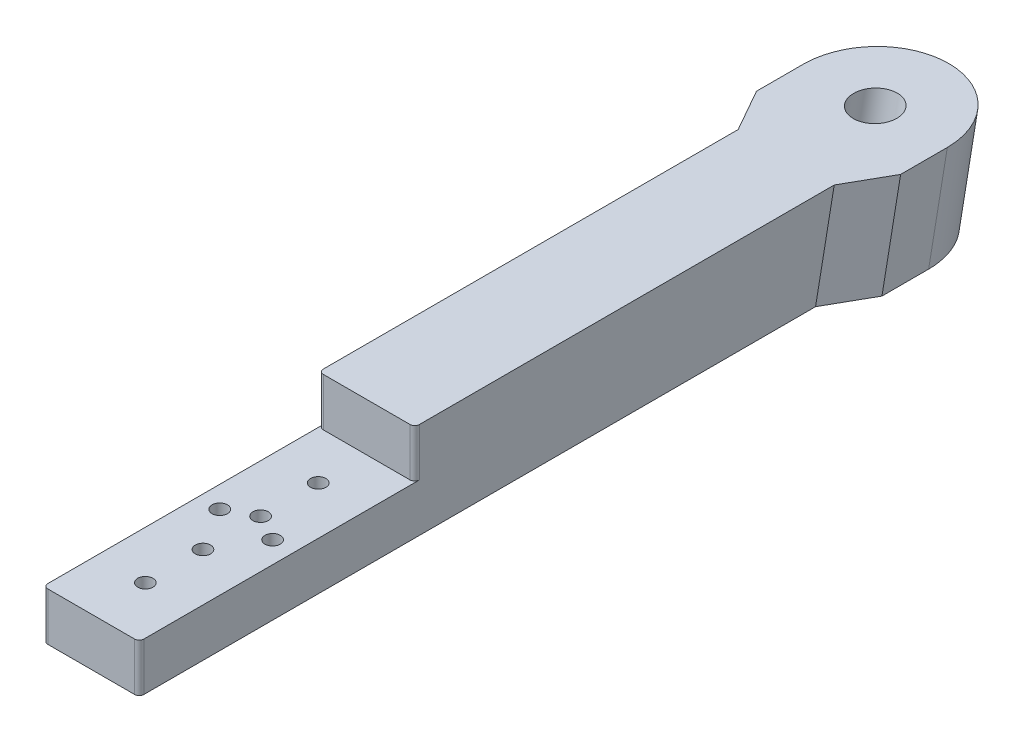
ISO-10303-21;
HEADER;
FILE_DESCRIPTION(('STEP AP214'),'2;1');
FILE_NAME('part.step','',(''),(''),'','','');
FILE_SCHEMA(('AUTOMOTIVE_DESIGN { 1 0 10303 214 1 1 1 1 }'));
ENDSEC;
DATA;
#1=APPLICATION_CONTEXT('core data for automotive mechanical design processes');
#2=APPLICATION_PROTOCOL_DEFINITION('international standard','automotive_design',2000,#1);
#3=PRODUCT_CONTEXT('',#1,'mechanical');
#4=PRODUCT('Part','Part','',(#3));
#5=PRODUCT_RELATED_PRODUCT_CATEGORY('part','',(#4));
#6=PRODUCT_DEFINITION_FORMATION('','',#4);
#7=PRODUCT_DEFINITION_CONTEXT('part definition',#1,'design');
#8=PRODUCT_DEFINITION('design','',#6,#7);
#9=PRODUCT_DEFINITION_SHAPE('','',#8);
#10=(LENGTH_UNIT() NAMED_UNIT(*) SI_UNIT(.MILLI.,.METRE.));
#11=(NAMED_UNIT(*) PLANE_ANGLE_UNIT() SI_UNIT($,.RADIAN.));
#12=(NAMED_UNIT(*) SI_UNIT($,.STERADIAN.) SOLID_ANGLE_UNIT());
#13=UNCERTAINTY_MEASURE_WITH_UNIT(LENGTH_MEASURE(1.E-05),#10,'distance_accuracy_value','');
#14=(GEOMETRIC_REPRESENTATION_CONTEXT(3) GLOBAL_UNCERTAINTY_ASSIGNED_CONTEXT((#13)) GLOBAL_UNIT_ASSIGNED_CONTEXT((#10,
#11,#12)) REPRESENTATION_CONTEXT('',''));
#15=CARTESIAN_POINT('',(0.,0.,0.));
#16=DIRECTION('',(0.,0.,1.));
#17=DIRECTION('',(1.,0.,0.));
#18=AXIS2_PLACEMENT_3D('',#15,#16,#17);
#19=CARTESIAN_POINT('',(-9.,10.,-58.35));
#20=DIRECTION('',(0.,1.,0.));
#21=DIRECTION('',(0.,0.,1.));
#22=AXIS2_PLACEMENT_3D('',#19,#20,#21);
#23=CYLINDRICAL_SURFACE('',#22,1.);
#24=CARTESIAN_POINT('',(-9.,10.,-58.35));
#25=DIRECTION('',(0.,1.,0.));
#26=DIRECTION('',(0.,0.,1.));
#27=AXIS2_PLACEMENT_3D('',#24,#25,#26);
#28=CIRCLE('',#27,1.);
#29=CARTESIAN_POINT('',(-10.,10.,-58.35));
#30=VERTEX_POINT('',#29);
#31=CARTESIAN_POINT('',(-9.,10.,-57.35));
#32=VERTEX_POINT('',#31);
#33=EDGE_CURVE('E268',#30,#32,#28,.T.);
#34=ORIENTED_EDGE('',*,*,#33,.F.);
#35=DIRECTION('',(0.,1.,0.));
#36=VECTOR('',#35,1.);
#37=CARTESIAN_POINT('',(-10.,10.,-58.35));
#38=LINE('',#37,#36);
#39=CARTESIAN_POINT('',(-10.,0.,-58.35));
#40=VERTEX_POINT('',#39);
#41=EDGE_CURVE('E251',#40,#30,#38,.T.);
#42=ORIENTED_EDGE('',*,*,#41,.F.);
#43=CARTESIAN_POINT('',(-9.,0.,-58.35));
#44=DIRECTION('',(0.,-1.,0.));
#45=DIRECTION('',(0.,0.,-1.));
#46=AXIS2_PLACEMENT_3D('',#43,#44,#45);
#47=CIRCLE('',#46,1.);
#48=CARTESIAN_POINT('',(-9.,0.,-57.35));
#49=VERTEX_POINT('',#48);
#50=EDGE_CURVE('E48',#49,#40,#47,.T.);
#51=ORIENTED_EDGE('',*,*,#50,.F.);
#52=DIRECTION('',(0.,-1.,0.));
#53=VECTOR('',#52,1.);
#54=CARTESIAN_POINT('',(-9.,0.,-57.35));
#55=LINE('',#54,#53);
#56=EDGE_CURVE('E330',#32,#49,#55,.T.);
#57=ORIENTED_EDGE('',*,*,#56,.F.);
#58=EDGE_LOOP('',(#34,#42,#51,#57));
#59=FACE_BOUND('',#58,.T.);
#60=ADVANCED_FACE('F17',(#59),#23,.T.);
#61=CARTESIAN_POINT('',(9.,-10.,-1.));
#62=DIRECTION('',(0.,1.,0.));
#63=DIRECTION('',(0.,0.,1.));
#64=AXIS2_PLACEMENT_3D('',#61,#62,#63);
#65=CYLINDRICAL_SURFACE('',#64,1.);
#66=CARTESIAN_POINT('',(9.,-10.,-1.));
#67=DIRECTION('',(0.,-1.,0.));
#68=DIRECTION('',(0.,0.,1.));
#69=AXIS2_PLACEMENT_3D('',#66,#67,#68);
#70=CIRCLE('',#69,1.);
#71=CARTESIAN_POINT('',(10.,-10.,-1.));
#72=VERTEX_POINT('',#71);
#73=CARTESIAN_POINT('',(9.,-10.,0.));
#74=VERTEX_POINT('',#73);
#75=EDGE_CURVE('E166',#72,#74,#70,.T.);
#76=ORIENTED_EDGE('',*,*,#75,.F.);
#77=DIRECTION('',(0.,-1.,0.));
#78=VECTOR('',#77,1.);
#79=CARTESIAN_POINT('',(10.,-10.,-1.));
#80=LINE('',#79,#78);
#81=CARTESIAN_POINT('',(10.,0.,-1.));
#82=VERTEX_POINT('',#81);
#83=EDGE_CURVE('E165',#82,#72,#80,.T.);
#84=ORIENTED_EDGE('',*,*,#83,.F.);
#85=CARTESIAN_POINT('',(9.,0.,-1.));
#86=DIRECTION('',(0.,1.,0.));
#87=DIRECTION('',(0.,0.,-1.));
#88=AXIS2_PLACEMENT_3D('',#85,#86,#87);
#89=CIRCLE('',#88,1.);
#90=CARTESIAN_POINT('',(9.,0.,0.));
#91=VERTEX_POINT('',#90);
#92=EDGE_CURVE('E150',#91,#82,#89,.T.);
#93=ORIENTED_EDGE('',*,*,#92,.F.);
#94=DIRECTION('',(0.,1.,0.));
#95=VECTOR('',#94,1.);
#96=CARTESIAN_POINT('',(9.,-10.,0.));
#97=LINE('',#96,#95);
#98=EDGE_CURVE('E232',#74,#91,#97,.T.);
#99=ORIENTED_EDGE('',*,*,#98,.F.);
#100=EDGE_LOOP('',(#76,#84,#93,#99));
#101=FACE_BOUND('',#100,.T.);
#102=ADVANCED_FACE('F19',(#101),#65,.T.);
#103=CARTESIAN_POINT('',(-9.,-10.,-1.));
#104=DIRECTION('',(0.,1.,0.));
#105=DIRECTION('',(0.,0.,1.));
#106=AXIS2_PLACEMENT_3D('',#103,#104,#105);
#107=CYLINDRICAL_SURFACE('',#106,1.);
#108=CARTESIAN_POINT('',(-9.,-10.,-1.));
#109=DIRECTION('',(0.,-1.,0.));
#110=DIRECTION('',(0.,0.,1.));
#111=AXIS2_PLACEMENT_3D('',#108,#109,#110);
#112=CIRCLE('',#111,1.);
#113=CARTESIAN_POINT('',(-9.,-10.,0.));
#114=VERTEX_POINT('',#113);
#115=CARTESIAN_POINT('',(-10.,-10.,-1.));
#116=VERTEX_POINT('',#115);
#117=EDGE_CURVE('E295',#114,#116,#112,.T.);
#118=ORIENTED_EDGE('',*,*,#117,.F.);
#119=DIRECTION('',(0.,-1.,0.));
#120=VECTOR('',#119,1.);
#121=CARTESIAN_POINT('',(-9.,-10.,0.));
#122=LINE('',#121,#120);
#123=CARTESIAN_POINT('',(-9.,0.,0.));
#124=VERTEX_POINT('',#123);
#125=EDGE_CURVE('E192',#124,#114,#122,.T.);
#126=ORIENTED_EDGE('',*,*,#125,.F.);
#127=CARTESIAN_POINT('',(-9.,0.,-1.));
#128=DIRECTION('',(0.,1.,0.));
#129=DIRECTION('',(0.,0.,-1.));
#130=AXIS2_PLACEMENT_3D('',#127,#128,#129);
#131=CIRCLE('',#130,1.);
#132=CARTESIAN_POINT('',(-10.,0.,-1.));
#133=VERTEX_POINT('',#132);
#134=EDGE_CURVE('E396',#133,#124,#131,.T.);
#135=ORIENTED_EDGE('',*,*,#134,.F.);
#136=DIRECTION('',(0.,1.,0.));
#137=VECTOR('',#136,1.);
#138=CARTESIAN_POINT('',(-10.,-10.,-1.));
#139=LINE('',#138,#137);
#140=EDGE_CURVE('E210',#116,#133,#139,.T.);
#141=ORIENTED_EDGE('',*,*,#140,.F.);
#142=EDGE_LOOP('',(#118,#126,#135,#141));
#143=FACE_BOUND('',#142,.T.);
#144=ADVANCED_FACE('F440',(#143),#107,.T.);
#145=CARTESIAN_POINT('',(9.,10.,-58.35));
#146=DIRECTION('',(0.,-1.,0.));
#147=DIRECTION('',(0.,0.,-1.));
#148=AXIS2_PLACEMENT_3D('',#145,#146,#147);
#149=CYLINDRICAL_SURFACE('',#148,1.);
#150=CARTESIAN_POINT('',(9.,0.,-58.35));
#151=DIRECTION('',(0.,-1.,0.));
#152=DIRECTION('',(0.,0.,-1.));
#153=AXIS2_PLACEMENT_3D('',#150,#151,#152);
#154=CIRCLE('',#153,1.);
#155=CARTESIAN_POINT('',(10.,0.,-58.35));
#156=VERTEX_POINT('',#155);
#157=CARTESIAN_POINT('',(9.,0.,-57.35));
#158=VERTEX_POINT('',#157);
#159=EDGE_CURVE('E38',#156,#158,#154,.T.);
#160=ORIENTED_EDGE('',*,*,#159,.F.);
#161=DIRECTION('',(0.,-1.,0.));
#162=VECTOR('',#161,1.);
#163=CARTESIAN_POINT('',(10.,0.,-58.35));
#164=LINE('',#163,#162);
#165=CARTESIAN_POINT('',(10.,10.,-58.35));
#166=VERTEX_POINT('',#165);
#167=EDGE_CURVE('E177',#166,#156,#164,.T.);
#168=ORIENTED_EDGE('',*,*,#167,.F.);
#169=CARTESIAN_POINT('',(9.,10.,-58.35));
#170=DIRECTION('',(0.,1.,0.));
#171=DIRECTION('',(0.,0.,1.));
#172=AXIS2_PLACEMENT_3D('',#169,#170,#171);
#173=CIRCLE('',#172,1.);
#174=CARTESIAN_POINT('',(9.,10.,-57.35));
#175=VERTEX_POINT('',#174);
#176=EDGE_CURVE('E348',#175,#166,#173,.T.);
#177=ORIENTED_EDGE('',*,*,#176,.F.);
#178=DIRECTION('',(0.,1.,0.));
#179=VECTOR('',#178,1.);
#180=CARTESIAN_POINT('',(9.,10.,-57.35));
#181=LINE('',#180,#179);
#182=EDGE_CURVE('E329',#158,#175,#181,.T.);
#183=ORIENTED_EDGE('',*,*,#182,.F.);
#184=EDGE_LOOP('',(#160,#168,#177,#183));
#185=FACE_BOUND('',#184,.T.);
#186=ADVANCED_FACE('F457',(#185),#149,.T.);
#187=CARTESIAN_POINT('',(0.,-89.1050538114157,-143.955178578699));
#188=DIRECTION('',(0.,0.981627183447664,-0.190808995376545));
#189=DIRECTION('',(0.,0.190808995376545,0.981627183447664));
#190=AXIS2_PLACEMENT_3D('',#187,#188,#189);
#191=CYLINDRICAL_SURFACE('',#190,4.5);
#192=CARTESIAN_POINT('',(0.,-10.,-159.331643392917));
#193=DIRECTION('',(0.,1.,0.));
#194=DIRECTION('',(0.,0.,-1.));
#195=AXIS2_PLACEMENT_3D('',#192,#193,#194);
#196=ELLIPSE('',#195,4.58422512729847,4.5);
#197=CARTESIAN_POINT('',(0.,-10.,-163.915868520215));
#198=VERTEX_POINT('',#197);
#199=EDGE_CURVE('E195',#198,#198,#196,.T.);
#200=ORIENTED_EDGE('',*,*,#199,.F.);
#201=EDGE_LOOP('',(#200));
#202=FACE_BOUND('',#201,.T.);
#203=CARTESIAN_POINT('',(0.,10.,-163.219249575672));
#204=DIRECTION('',(0.,1.,0.));
#205=DIRECTION('',(0.,0.,-1.));
#206=AXIS2_PLACEMENT_3D('',#203,#204,#205);
#207=ELLIPSE('',#206,4.58422512729847,4.5);
#208=CARTESIAN_POINT('',(0.,10.,-167.80347470297));
#209=VERTEX_POINT('',#208);
#210=EDGE_CURVE('E273',#209,#209,#207,.T.);
#211=ORIENTED_EDGE('',*,*,#210,.T.);
#212=EDGE_LOOP('',(#211));
#213=FACE_BOUND('',#212,.T.);
#214=ADVANCED_FACE('F459',(#202,#213),#191,.F.);
#215=CARTESIAN_POINT('',(10.,-36.3704402176721,-135.664154124732));
#216=DIRECTION('',(-0.866025403784439,-0.0954044976882714,-0.490813591723832));
#217=DIRECTION('',(-0.4930626537927,0.,0.86999380425087));
#218=AXIS2_PLACEMENT_3D('',#215,#216,#217);
#219=PLANE('',#218);
#220=DIRECTION('',(-0.4930626537927,0.,0.869993804250869));
#221=VECTOR('',#220,1.);
#222=CARTESIAN_POINT('',(-52.8246116828498,-10.,-29.9379640345166));
#223=LINE('',#222,#221);
#224=CARTESIAN_POINT('',(15.,-10.,-149.612393817246));
#225=VERTEX_POINT('',#224);
#226=CARTESIAN_POINT('',(10.,-10.,-140.79004844634));
#227=VERTEX_POINT('',#226);
#228=EDGE_CURVE('E311',#225,#227,#223,.T.);
#229=ORIENTED_EDGE('',*,*,#228,.F.);
#230=DIRECTION('',(0.,-0.981627183447664,0.190808995376543));
#231=VECTOR('',#230,1.);
#232=CARTESIAN_POINT('',(15.,10.,-153.5));
#233=LINE('',#232,#231);
#234=CARTESIAN_POINT('',(15.,10.,-153.5));
#235=VERTEX_POINT('',#234);
#236=EDGE_CURVE('E224',#235,#225,#233,.T.);
#237=ORIENTED_EDGE('',*,*,#236,.F.);
#238=DIRECTION('',(0.4930626537927,0.,-0.869993804250869));
#239=VECTOR('',#238,1.);
#240=CARTESIAN_POINT('',(6.13355571885567,10.,-137.855433267971));
#241=LINE('',#240,#239);
#242=CARTESIAN_POINT('',(10.,10.,-144.677654629095));
#243=VERTEX_POINT('',#242);
#244=EDGE_CURVE('E351',#243,#235,#241,.T.);
#245=ORIENTED_EDGE('',*,*,#244,.F.);
#246=DIRECTION('',(0.,0.981627183447664,-0.190808995376543));
#247=VECTOR('',#246,1.);
#248=CARTESIAN_POINT('',(10.,-36.3704402176721,-135.664154124732));
#249=LINE('',#248,#247);
#250=EDGE_CURVE('E205',#227,#243,#249,.T.);
#251=ORIENTED_EDGE('',*,*,#250,.F.);
#252=EDGE_LOOP('',(#229,#237,#245,#251));
#253=FACE_BOUND('',#252,.T.);
#254=ADVANCED_FACE('F420',(#253),#219,.F.);
#255=CARTESIAN_POINT('',(-10.,-7.61938417300116,-141.25279328673));
#256=DIRECTION('',(0.866025403784438,-0.0954044976882717,-0.490813591723833));
#257=DIRECTION('',(0.,-0.981627183447664,0.190808995376543));
#258=AXIS2_PLACEMENT_3D('',#255,#256,#257);
#259=PLANE('',#258);
#260=DIRECTION('',(0.493062653792701,0.,0.869993804250869));
#261=VECTOR('',#260,1.);
#262=CARTESIAN_POINT('',(-8.53086649914912,10.,-142.085414001));
#263=LINE('',#262,#261);
#264=CARTESIAN_POINT('',(-15.,10.,-153.5));
#265=VERTEX_POINT('',#264);
#266=CARTESIAN_POINT('',(-10.,10.,-144.677654629095));
#267=VERTEX_POINT('',#266);
#268=EDGE_CURVE('E338',#265,#267,#263,.T.);
#269=ORIENTED_EDGE('',*,*,#268,.F.);
#270=DIRECTION('',(0.,-0.981627183447664,0.190808995376543));
#271=VECTOR('',#270,1.);
#272=CARTESIAN_POINT('',(-15.,10.,-153.5));
#273=LINE('',#272,#271);
#274=CARTESIAN_POINT('',(-15.,-10.,-149.612393817246));
#275=VERTEX_POINT('',#274);
#276=EDGE_CURVE('E11',#265,#275,#273,.T.);
#277=ORIENTED_EDGE('',*,*,#276,.T.);
#278=DIRECTION('',(-0.493062653792701,0.,-0.869993804250869));
#279=VECTOR('',#278,1.);
#280=CARTESIAN_POINT('',(52.82461168285,-10.,-29.9379640345168));
#281=LINE('',#280,#279);
#282=CARTESIAN_POINT('',(-10.,-10.,-140.79004844634));
#283=VERTEX_POINT('',#282);
#284=EDGE_CURVE('E298',#283,#275,#281,.T.);
#285=ORIENTED_EDGE('',*,*,#284,.F.);
#286=DIRECTION('',(0.,-0.981627183447664,0.190808995376543));
#287=VECTOR('',#286,1.);
#288=CARTESIAN_POINT('',(-10.,-7.61938417300115,-141.25279328673));
#289=LINE('',#288,#287);
#290=EDGE_CURVE('E211',#267,#283,#289,.T.);
#291=ORIENTED_EDGE('',*,*,#290,.F.);
#292=EDGE_LOOP('',(#269,#277,#285,#291));
#293=FACE_BOUND('',#292,.T.);
#294=ADVANCED_FACE('F450',(#293),#259,.F.);
#295=CARTESIAN_POINT('',(0.,-30.2074228045558,-155.403718301291));
#296=DIRECTION('',(0.,-0.981627183447664,0.190808995376544));
#297=DIRECTION('',(0.,-0.190808995376544,-0.981627183447664));
#298=AXIS2_PLACEMENT_3D('',#295,#296,#297);
#299=CYLINDRICAL_SURFACE('',#298,15.);
#300=CARTESIAN_POINT('',(0.,-10.,-159.331643392917));
#301=DIRECTION('',(0.,-1.,0.));
#302=DIRECTION('',(0.,0.,1.));
#303=AXIS2_PLACEMENT_3D('',#300,#301,#302);
#304=ELLIPSE('',#303,15.2807504243282,15.);
#305=CARTESIAN_POINT('',(-15.,-10.,-159.331643392917));
#306=VERTEX_POINT('',#305);
#307=CARTESIAN_POINT('',(15.,-10.,-159.331643392917));
#308=VERTEX_POINT('',#307);
#309=EDGE_CURVE('E256',#306,#308,#304,.T.);
#310=ORIENTED_EDGE('',*,*,#309,.F.);
#311=DIRECTION('',(0.,-0.981627183447664,0.190808995376544));
#312=VECTOR('',#311,1.);
#313=CARTESIAN_POINT('',(-15.,-30.2074228045558,-155.403718301291));
#314=LINE('',#313,#312);
#315=CARTESIAN_POINT('',(-15.,10.,-163.219249575672));
#316=VERTEX_POINT('',#315);
#317=EDGE_CURVE('E26',#316,#306,#314,.T.);
#318=ORIENTED_EDGE('',*,*,#317,.F.);
#319=CARTESIAN_POINT('',(0.,10.,-163.219249575672));
#320=DIRECTION('',(0.,1.,0.));
#321=DIRECTION('',(0.,0.,1.));
#322=AXIS2_PLACEMENT_3D('',#319,#320,#321);
#323=ELLIPSE('',#322,15.2807504243282,15.);
#324=CARTESIAN_POINT('',(15.,10.,-163.219249575672));
#325=VERTEX_POINT('',#324);
#326=EDGE_CURVE('E359',#325,#316,#323,.T.);
#327=ORIENTED_EDGE('',*,*,#326,.F.);
#328=DIRECTION('',(0.,0.981627183447664,-0.190808995376544));
#329=VECTOR('',#328,1.);
#330=CARTESIAN_POINT('',(15.,12.8621349306482,-163.775592248285));
#331=LINE('',#330,#329);
#332=EDGE_CURVE('E302',#308,#325,#331,.T.);
#333=ORIENTED_EDGE('',*,*,#332,.F.);
#334=EDGE_LOOP('',(#310,#318,#327,#333));
#335=FACE_BOUND('',#334,.T.);
#336=ADVANCED_FACE('F427',(#335),#299,.T.);
#337=CARTESIAN_POINT('',(-15.,0.,0.));
#338=DIRECTION('',(1.,0.,0.));
#339=DIRECTION('',(0.,-1.,0.));
#340=AXIS2_PLACEMENT_3D('',#337,#338,#339);
#341=PLANE('',#340);
#342=DIRECTION('',(0.,0.,1.));
#343=VECTOR('',#342,1.);
#344=CARTESIAN_POINT('',(-15.,10.,-178.5));
#345=LINE('',#344,#343);
#346=EDGE_CURVE('E341',#316,#265,#345,.T.);
#347=ORIENTED_EDGE('',*,*,#346,.F.);
#348=ORIENTED_EDGE('',*,*,#317,.T.);
#349=DIRECTION('',(0.,0.,-1.));
#350=VECTOR('',#349,1.);
#351=CARTESIAN_POINT('',(-15.,-10.,-149.612393817246));
#352=LINE('',#351,#350);
#353=EDGE_CURVE('E261',#275,#306,#352,.T.);
#354=ORIENTED_EDGE('',*,*,#353,.F.);
#355=ORIENTED_EDGE('',*,*,#276,.F.);
#356=EDGE_LOOP('',(#347,#348,#354,#355));
#357=FACE_BOUND('',#356,.T.);
#358=ADVANCED_FACE('F452',(#357),#341,.F.);
#359=CARTESIAN_POINT('',(15.,0.,0.));
#360=DIRECTION('',(1.,0.,0.));
#361=DIRECTION('',(0.,-1.,0.));
#362=AXIS2_PLACEMENT_3D('',#359,#360,#361);
#363=PLANE('',#362);
#364=DIRECTION('',(0.,0.,-1.));
#365=VECTOR('',#364,1.);
#366=CARTESIAN_POINT('',(15.,-10.,-149.612393817246));
#367=LINE('',#366,#365);
#368=EDGE_CURVE('E260',#225,#308,#367,.T.);
#369=ORIENTED_EDGE('',*,*,#368,.T.);
#370=ORIENTED_EDGE('',*,*,#332,.T.);
#371=DIRECTION('',(0.,0.,1.));
#372=VECTOR('',#371,1.);
#373=CARTESIAN_POINT('',(15.,10.,-178.5));
#374=LINE('',#373,#372);
#375=EDGE_CURVE('E355',#325,#235,#374,.T.);
#376=ORIENTED_EDGE('',*,*,#375,.T.);
#377=ORIENTED_EDGE('',*,*,#236,.T.);
#378=EDGE_LOOP('',(#369,#370,#376,#377));
#379=FACE_BOUND('',#378,.T.);
#380=ADVANCED_FACE('F415',(#379),#363,.T.);
#381=CARTESIAN_POINT('',(5.5,110.,-32.26));
#382=DIRECTION('',(0.,-1.,0.));
#383=DIRECTION('',(0.,0.,-1.));
#384=AXIS2_PLACEMENT_3D('',#381,#382,#383);
#385=CYLINDRICAL_SURFACE('',#384,1.6);
#386=CARTESIAN_POINT('',(5.5,0.,-32.26));
#387=DIRECTION('',(0.,1.,0.));
#388=DIRECTION('',(0.,0.,-1.));
#389=AXIS2_PLACEMENT_3D('',#386,#387,#388);
#390=CIRCLE('',#389,1.6);
#391=CARTESIAN_POINT('',(5.5,0.,-33.86));
#392=VERTEX_POINT('',#391);
#393=EDGE_CURVE('E378',#392,#392,#390,.T.);
#394=ORIENTED_EDGE('',*,*,#393,.T.);
#395=EDGE_LOOP('',(#394));
#396=FACE_BOUND('',#395,.T.);
#397=CARTESIAN_POINT('',(5.5,-4.3,-32.26));
#398=DIRECTION('',(0.,-1.,0.));
#399=DIRECTION('',(0.,0.,1.));
#400=AXIS2_PLACEMENT_3D('',#397,#398,#399);
#401=CIRCLE('',#400,1.6);
#402=CARTESIAN_POINT('',(5.5,-4.3,-30.66));
#403=VERTEX_POINT('',#402);
#404=EDGE_CURVE('E191',#403,#403,#401,.T.);
#405=ORIENTED_EDGE('',*,*,#404,.T.);
#406=EDGE_LOOP('',(#405));
#407=FACE_BOUND('',#406,.T.);
#408=ADVANCED_FACE('F516',(#396,#407),#385,.F.);
#409=CARTESIAN_POINT('',(-5.5,110.,-32.26));
#410=DIRECTION('',(0.,-1.,0.));
#411=DIRECTION('',(0.,0.,-1.));
#412=AXIS2_PLACEMENT_3D('',#409,#410,#411);
#413=CYLINDRICAL_SURFACE('',#412,1.6);
#414=CARTESIAN_POINT('',(-5.5,0.,-32.26));
#415=DIRECTION('',(0.,1.,0.));
#416=DIRECTION('',(0.,0.,-1.));
#417=AXIS2_PLACEMENT_3D('',#414,#415,#416);
#418=CIRCLE('',#417,1.6);
#419=CARTESIAN_POINT('',(-5.5,0.,-33.86));
#420=VERTEX_POINT('',#419);
#421=EDGE_CURVE('E374',#420,#420,#418,.T.);
#422=ORIENTED_EDGE('',*,*,#421,.T.);
#423=EDGE_LOOP('',(#422));
#424=FACE_BOUND('',#423,.T.);
#425=CARTESIAN_POINT('',(-5.5,-4.3,-32.26));
#426=DIRECTION('',(0.,-1.,0.));
#427=DIRECTION('',(0.,0.,1.));
#428=AXIS2_PLACEMENT_3D('',#425,#426,#427);
#429=CIRCLE('',#428,1.6);
#430=CARTESIAN_POINT('',(-5.5,-4.3,-30.66));
#431=VERTEX_POINT('',#430);
#432=EDGE_CURVE('E190',#431,#431,#429,.T.);
#433=ORIENTED_EDGE('',*,*,#432,.T.);
#434=EDGE_LOOP('',(#433));
#435=FACE_BOUND('',#434,.T.);
#436=ADVANCED_FACE('F512',(#424,#435),#413,.F.);
#437=CARTESIAN_POINT('',(-5.5,-4.3,-32.26));
#438=DIRECTION('',(0.,-1.,0.));
#439=DIRECTION('',(0.,0.,-1.));
#440=AXIS2_PLACEMENT_3D('',#437,#438,#439);
#441=CYLINDRICAL_SURFACE('',#440,2.3);
#442=CARTESIAN_POINT('',(-5.5,-10.,-32.26));
#443=DIRECTION('',(0.,1.,0.));
#444=DIRECTION('',(0.,0.,1.));
#445=AXIS2_PLACEMENT_3D('',#442,#443,#444);
#446=CIRCLE('',#445,2.3);
#447=CARTESIAN_POINT('',(-5.5,-10.,-29.96));
#448=VERTEX_POINT('',#447);
#449=EDGE_CURVE('E185',#448,#448,#446,.T.);
#450=ORIENTED_EDGE('',*,*,#449,.F.);
#451=EDGE_LOOP('',(#450));
#452=FACE_BOUND('',#451,.T.);
#453=CARTESIAN_POINT('',(-5.5,-4.3,-32.26));
#454=DIRECTION('',(0.,1.,0.));
#455=DIRECTION('',(0.,0.,1.));
#456=AXIS2_PLACEMENT_3D('',#453,#454,#455);
#457=CIRCLE('',#456,2.3);
#458=CARTESIAN_POINT('',(-5.5,-4.3,-29.96));
#459=VERTEX_POINT('',#458);
#460=EDGE_CURVE('E280',#459,#459,#457,.T.);
#461=ORIENTED_EDGE('',*,*,#460,.T.);
#462=EDGE_LOOP('',(#461));
#463=FACE_BOUND('',#462,.T.);
#464=ADVANCED_FACE('F515',(#452,#463),#441,.F.);
#465=CARTESIAN_POINT('',(-5.5,-4.3,-32.26));
#466=DIRECTION('',(0.,1.,0.));
#467=DIRECTION('',(1.,0.,0.));
#468=AXIS2_PLACEMENT_3D('',#465,#466,#467);
#469=PLANE('',#468);
#470=ORIENTED_EDGE('',*,*,#460,.F.);
#471=EDGE_LOOP('',(#470));
#472=FACE_BOUND('',#471,.T.);
#473=ORIENTED_EDGE('',*,*,#432,.F.);
#474=EDGE_LOOP('',(#473));
#475=FACE_BOUND('',#474,.T.);
#476=ADVANCED_FACE('F521',(#472,#475),#469,.F.);
#477=CARTESIAN_POINT('',(5.5,-4.3,-32.26));
#478=DIRECTION('',(0.,-1.,0.));
#479=DIRECTION('',(0.,0.,-1.));
#480=AXIS2_PLACEMENT_3D('',#477,#478,#479);
#481=CYLINDRICAL_SURFACE('',#480,2.3);
#482=CARTESIAN_POINT('',(5.5,-10.,-32.26));
#483=DIRECTION('',(0.,1.,0.));
#484=DIRECTION('',(0.,0.,1.));
#485=AXIS2_PLACEMENT_3D('',#482,#483,#484);
#486=CIRCLE('',#485,2.3);
#487=CARTESIAN_POINT('',(5.5,-10.,-29.96));
#488=VERTEX_POINT('',#487);
#489=EDGE_CURVE('E334',#488,#488,#486,.T.);
#490=ORIENTED_EDGE('',*,*,#489,.F.);
#491=EDGE_LOOP('',(#490));
#492=FACE_BOUND('',#491,.T.);
#493=CARTESIAN_POINT('',(5.5,-4.3,-32.26));
#494=DIRECTION('',(0.,1.,0.));
#495=DIRECTION('',(0.,0.,1.));
#496=AXIS2_PLACEMENT_3D('',#493,#494,#495);
#497=CIRCLE('',#496,2.3);
#498=CARTESIAN_POINT('',(5.5,-4.3,-29.96));
#499=VERTEX_POINT('',#498);
#500=EDGE_CURVE('E186',#499,#499,#497,.T.);
#501=ORIENTED_EDGE('',*,*,#500,.T.);
#502=EDGE_LOOP('',(#501));
#503=FACE_BOUND('',#502,.T.);
#504=ADVANCED_FACE('F524',(#492,#503),#481,.F.);
#505=CARTESIAN_POINT('',(5.5,-4.3,-32.26));
#506=DIRECTION('',(0.,1.,0.));
#507=DIRECTION('',(1.,0.,0.));
#508=AXIS2_PLACEMENT_3D('',#505,#506,#507);
#509=PLANE('',#508);
#510=ORIENTED_EDGE('',*,*,#500,.F.);
#511=EDGE_LOOP('',(#510));
#512=FACE_BOUND('',#511,.T.);
#513=ORIENTED_EDGE('',*,*,#404,.F.);
#514=EDGE_LOOP('',(#513));
#515=FACE_BOUND('',#514,.T.);
#516=ADVANCED_FACE('F547',(#512,#515),#509,.F.);
#517=CARTESIAN_POINT('',(0.,-6.,-35.26));
#518=DIRECTION('',(0.,-1.,0.));
#519=DIRECTION('',(0.,0.,-1.));
#520=AXIS2_PLACEMENT_3D('',#517,#518,#519);
#521=CYLINDRICAL_SURFACE('',#520,3.);
#522=CARTESIAN_POINT('',(0.,-10.,-35.26));
#523=DIRECTION('',(0.,1.,0.));
#524=DIRECTION('',(0.,0.,1.));
#525=AXIS2_PLACEMENT_3D('',#522,#523,#524);
#526=CIRCLE('',#525,3.);
#527=CARTESIAN_POINT('',(0.,-10.,-32.26));
#528=VERTEX_POINT('',#527);
#529=EDGE_CURVE('E246',#528,#528,#526,.T.);
#530=ORIENTED_EDGE('',*,*,#529,.F.);
#531=EDGE_LOOP('',(#530));
#532=FACE_BOUND('',#531,.T.);
#533=CARTESIAN_POINT('',(0.,-6.,-35.26));
#534=DIRECTION('',(0.,1.,0.));
#535=DIRECTION('',(0.,0.,1.));
#536=AXIS2_PLACEMENT_3D('',#533,#534,#535);
#537=CIRCLE('',#536,3.);
#538=CARTESIAN_POINT('',(0.,-6.,-32.26));
#539=VERTEX_POINT('',#538);
#540=EDGE_CURVE('E255',#539,#539,#537,.T.);
#541=ORIENTED_EDGE('',*,*,#540,.T.);
#542=EDGE_LOOP('',(#541));
#543=FACE_BOUND('',#542,.T.);
#544=ADVANCED_FACE('F543',(#532,#543),#521,.F.);
#545=CARTESIAN_POINT('',(0.,-6.,-35.26));
#546=DIRECTION('',(0.,1.,0.));
#547=DIRECTION('',(1.,0.,0.));
#548=AXIS2_PLACEMENT_3D('',#545,#546,#547);
#549=PLANE('',#548);
#550=CARTESIAN_POINT('',(0.,-6.,-35.26));
#551=DIRECTION('',(0.,-1.,0.));
#552=DIRECTION('',(0.,0.,1.));
#553=AXIS2_PLACEMENT_3D('',#550,#551,#552);
#554=CIRCLE('',#553,1.6);
#555=CARTESIAN_POINT('',(0.,-6.,-33.66));
#556=VERTEX_POINT('',#555);
#557=EDGE_CURVE('E217',#556,#556,#554,.T.);
#558=ORIENTED_EDGE('',*,*,#557,.F.);
#559=EDGE_LOOP('',(#558));
#560=FACE_BOUND('',#559,.T.);
#561=ORIENTED_EDGE('',*,*,#540,.F.);
#562=EDGE_LOOP('',(#561));
#563=FACE_BOUND('',#562,.T.);
#564=ADVANCED_FACE('F539',(#560,#563),#549,.F.);
#565=CARTESIAN_POINT('',(0.,-6.,-47.26));
#566=DIRECTION('',(0.,-1.,0.));
#567=DIRECTION('',(0.,0.,-1.));
#568=AXIS2_PLACEMENT_3D('',#565,#566,#567);
#569=CYLINDRICAL_SURFACE('',#568,3.);
#570=CARTESIAN_POINT('',(0.,-10.,-47.26));
#571=DIRECTION('',(0.,1.,0.));
#572=DIRECTION('',(0.,0.,1.));
#573=AXIS2_PLACEMENT_3D('',#570,#571,#572);
#574=CIRCLE('',#573,3.);
#575=CARTESIAN_POINT('',(0.,-10.,-44.26));
#576=VERTEX_POINT('',#575);
#577=EDGE_CURVE('E325',#576,#576,#574,.T.);
#578=ORIENTED_EDGE('',*,*,#577,.F.);
#579=EDGE_LOOP('',(#578));
#580=FACE_BOUND('',#579,.T.);
#581=CARTESIAN_POINT('',(0.,-6.,-47.26));
#582=DIRECTION('',(0.,1.,0.));
#583=DIRECTION('',(0.,0.,1.));
#584=AXIS2_PLACEMENT_3D('',#581,#582,#583);
#585=CIRCLE('',#584,3.);
#586=CARTESIAN_POINT('',(0.,-6.,-44.26));
#587=VERTEX_POINT('',#586);
#588=EDGE_CURVE('E284',#587,#587,#585,.T.);
#589=ORIENTED_EDGE('',*,*,#588,.T.);
#590=EDGE_LOOP('',(#589));
#591=FACE_BOUND('',#590,.T.);
#592=ADVANCED_FACE('F535',(#580,#591),#569,.F.);
#593=CARTESIAN_POINT('',(0.,-6.,-47.26));
#594=DIRECTION('',(0.,1.,0.));
#595=DIRECTION('',(1.,0.,0.));
#596=AXIS2_PLACEMENT_3D('',#593,#594,#595);
#597=PLANE('',#596);
#598=CARTESIAN_POINT('',(0.,-6.,-47.26));
#599=DIRECTION('',(0.,-1.,0.));
#600=DIRECTION('',(0.,0.,1.));
#601=AXIS2_PLACEMENT_3D('',#598,#599,#600);
#602=CIRCLE('',#601,1.6);
#603=CARTESIAN_POINT('',(0.,-6.,-45.66));
#604=VERTEX_POINT('',#603);
#605=EDGE_CURVE('E212',#604,#604,#602,.T.);
#606=ORIENTED_EDGE('',*,*,#605,.F.);
#607=EDGE_LOOP('',(#606));
#608=FACE_BOUND('',#607,.T.);
#609=ORIENTED_EDGE('',*,*,#588,.F.);
#610=EDGE_LOOP('',(#609));
#611=FACE_BOUND('',#610,.T.);
#612=ADVANCED_FACE('F528',(#608,#611),#597,.F.);
#613=CARTESIAN_POINT('',(0.,-6.,-11.26));
#614=DIRECTION('',(0.,-1.,0.));
#615=DIRECTION('',(0.,0.,-1.));
#616=AXIS2_PLACEMENT_3D('',#613,#614,#615);
#617=CYLINDRICAL_SURFACE('',#616,3.);
#618=CARTESIAN_POINT('',(0.,-10.,-11.26));
#619=DIRECTION('',(0.,1.,0.));
#620=DIRECTION('',(0.,0.,1.));
#621=AXIS2_PLACEMENT_3D('',#618,#619,#620);
#622=CIRCLE('',#621,3.);
#623=CARTESIAN_POINT('',(0.,-10.,-8.26));
#624=VERTEX_POINT('',#623);
#625=EDGE_CURVE('E247',#624,#624,#622,.T.);
#626=ORIENTED_EDGE('',*,*,#625,.F.);
#627=EDGE_LOOP('',(#626));
#628=FACE_BOUND('',#627,.T.);
#629=CARTESIAN_POINT('',(0.,-6.,-11.26));
#630=DIRECTION('',(0.,1.,0.));
#631=DIRECTION('',(0.,0.,1.));
#632=AXIS2_PLACEMENT_3D('',#629,#630,#631);
#633=CIRCLE('',#632,3.);
#634=CARTESIAN_POINT('',(0.,-6.,-8.26));
#635=VERTEX_POINT('',#634);
#636=EDGE_CURVE('E363',#635,#635,#633,.T.);
#637=ORIENTED_EDGE('',*,*,#636,.T.);
#638=EDGE_LOOP('',(#637));
#639=FACE_BOUND('',#638,.T.);
#640=ADVANCED_FACE('F506',(#628,#639),#617,.F.);
#641=CARTESIAN_POINT('',(0.,-6.,-11.26));
#642=DIRECTION('',(0.,1.,0.));
#643=DIRECTION('',(1.,0.,0.));
#644=AXIS2_PLACEMENT_3D('',#641,#642,#643);
#645=PLANE('',#644);
#646=CARTESIAN_POINT('',(0.,-6.,-11.26));
#647=DIRECTION('',(0.,-1.,0.));
#648=DIRECTION('',(0.,0.,1.));
#649=AXIS2_PLACEMENT_3D('',#646,#647,#648);
#650=CIRCLE('',#649,1.6);
#651=CARTESIAN_POINT('',(0.,-6.,-9.66));
#652=VERTEX_POINT('',#651);
#653=EDGE_CURVE('E216',#652,#652,#650,.T.);
#654=ORIENTED_EDGE('',*,*,#653,.F.);
#655=EDGE_LOOP('',(#654));
#656=FACE_BOUND('',#655,.T.);
#657=ORIENTED_EDGE('',*,*,#636,.F.);
#658=EDGE_LOOP('',(#657));
#659=FACE_BOUND('',#658,.T.);
#660=ADVANCED_FACE('F502',(#656,#659),#645,.F.);
#661=CARTESIAN_POINT('',(0.,-6.,-23.26));
#662=DIRECTION('',(0.,-1.,0.));
#663=DIRECTION('',(0.,0.,-1.));
#664=AXIS2_PLACEMENT_3D('',#661,#662,#663);
#665=CYLINDRICAL_SURFACE('',#664,3.);
#666=CARTESIAN_POINT('',(0.,-10.,-23.26));
#667=DIRECTION('',(0.,1.,0.));
#668=DIRECTION('',(0.,0.,1.));
#669=AXIS2_PLACEMENT_3D('',#666,#667,#668);
#670=CIRCLE('',#669,3.);
#671=CARTESIAN_POINT('',(0.,-10.,-20.26));
#672=VERTEX_POINT('',#671);
#673=EDGE_CURVE('E242',#672,#672,#670,.T.);
#674=ORIENTED_EDGE('',*,*,#673,.F.);
#675=EDGE_LOOP('',(#674));
#676=FACE_BOUND('',#675,.T.);
#677=CARTESIAN_POINT('',(0.,-6.,-23.26));
#678=DIRECTION('',(0.,1.,0.));
#679=DIRECTION('',(0.,0.,1.));
#680=AXIS2_PLACEMENT_3D('',#677,#678,#679);
#681=CIRCLE('',#680,3.);
#682=CARTESIAN_POINT('',(0.,-6.,-20.26));
#683=VERTEX_POINT('',#682);
#684=EDGE_CURVE('E367',#683,#683,#681,.T.);
#685=ORIENTED_EDGE('',*,*,#684,.T.);
#686=EDGE_LOOP('',(#685));
#687=FACE_BOUND('',#686,.T.);
#688=ADVANCED_FACE('F505',(#676,#687),#665,.F.);
#689=CARTESIAN_POINT('',(0.,-6.,-23.26));
#690=DIRECTION('',(0.,1.,0.));
#691=DIRECTION('',(1.,0.,0.));
#692=AXIS2_PLACEMENT_3D('',#689,#690,#691);
#693=PLANE('',#692);
#694=CARTESIAN_POINT('',(0.,-6.,-23.26));
#695=DIRECTION('',(0.,-1.,0.));
#696=DIRECTION('',(0.,0.,1.));
#697=AXIS2_PLACEMENT_3D('',#694,#695,#696);
#698=CIRCLE('',#697,1.6);
#699=CARTESIAN_POINT('',(0.,-6.,-21.66));
#700=VERTEX_POINT('',#699);
#701=EDGE_CURVE('E387',#700,#700,#698,.T.);
#702=ORIENTED_EDGE('',*,*,#701,.F.);
#703=EDGE_LOOP('',(#702));
#704=FACE_BOUND('',#703,.T.);
#705=ORIENTED_EDGE('',*,*,#684,.F.);
#706=EDGE_LOOP('',(#705));
#707=FACE_BOUND('',#706,.T.);
#708=ADVANCED_FACE('F510',(#704,#707),#693,.F.);
#709=CARTESIAN_POINT('',(0.,165.,-23.26));
#710=DIRECTION('',(0.,-1.,0.));
#711=DIRECTION('',(0.,0.,-1.));
#712=AXIS2_PLACEMENT_3D('',#709,#710,#711);
#713=CYLINDRICAL_SURFACE('',#712,1.6);
#714=CARTESIAN_POINT('',(0.,0.,-23.26));
#715=DIRECTION('',(0.,-1.,0.));
#716=DIRECTION('',(0.,0.,-1.));
#717=AXIS2_PLACEMENT_3D('',#714,#715,#716);
#718=CIRCLE('',#717,1.6);
#719=CARTESIAN_POINT('',(0.,0.,-24.86));
#720=VERTEX_POINT('',#719);
#721=EDGE_CURVE('E202',#720,#720,#718,.T.);
#722=ORIENTED_EDGE('',*,*,#721,.F.);
#723=EDGE_LOOP('',(#722));
#724=FACE_BOUND('',#723,.T.);
#725=ORIENTED_EDGE('',*,*,#701,.T.);
#726=EDGE_LOOP('',(#725));
#727=FACE_BOUND('',#726,.T.);
#728=ADVANCED_FACE('F491',(#724,#727),#713,.F.);
#729=CARTESIAN_POINT('',(0.,165.,-11.26));
#730=DIRECTION('',(0.,-1.,0.));
#731=DIRECTION('',(0.,0.,-1.));
#732=AXIS2_PLACEMENT_3D('',#729,#730,#731);
#733=CYLINDRICAL_SURFACE('',#732,1.6);
#734=CARTESIAN_POINT('',(0.,0.,-11.26));
#735=DIRECTION('',(0.,-1.,0.));
#736=DIRECTION('',(0.,0.,-1.));
#737=AXIS2_PLACEMENT_3D('',#734,#735,#736);
#738=CIRCLE('',#737,1.6);
#739=CARTESIAN_POINT('',(0.,0.,-12.86));
#740=VERTEX_POINT('',#739);
#741=EDGE_CURVE('E197',#740,#740,#738,.T.);
#742=ORIENTED_EDGE('',*,*,#741,.F.);
#743=EDGE_LOOP('',(#742));
#744=FACE_BOUND('',#743,.T.);
#745=ORIENTED_EDGE('',*,*,#653,.T.);
#746=EDGE_LOOP('',(#745));
#747=FACE_BOUND('',#746,.T.);
#748=ADVANCED_FACE('F487',(#744,#747),#733,.F.);
#749=CARTESIAN_POINT('',(0.,165.,-47.26));
#750=DIRECTION('',(0.,-1.,0.));
#751=DIRECTION('',(0.,0.,-1.));
#752=AXIS2_PLACEMENT_3D('',#749,#750,#751);
#753=CYLINDRICAL_SURFACE('',#752,1.6);
#754=CARTESIAN_POINT('',(0.,0.,-47.26));
#755=DIRECTION('',(0.,-1.,0.));
#756=DIRECTION('',(0.,0.,-1.));
#757=AXIS2_PLACEMENT_3D('',#754,#755,#756);
#758=CIRCLE('',#757,1.6);
#759=CARTESIAN_POINT('',(0.,0.,-48.86));
#760=VERTEX_POINT('',#759);
#761=EDGE_CURVE('E201',#760,#760,#758,.T.);
#762=ORIENTED_EDGE('',*,*,#761,.F.);
#763=EDGE_LOOP('',(#762));
#764=FACE_BOUND('',#763,.T.);
#765=ORIENTED_EDGE('',*,*,#605,.T.);
#766=EDGE_LOOP('',(#765));
#767=FACE_BOUND('',#766,.T.);
#768=ADVANCED_FACE('F490',(#764,#767),#753,.F.);
#769=CARTESIAN_POINT('',(0.,165.,-35.26));
#770=DIRECTION('',(0.,-1.,0.));
#771=DIRECTION('',(0.,0.,-1.));
#772=AXIS2_PLACEMENT_3D('',#769,#770,#771);
#773=CYLINDRICAL_SURFACE('',#772,1.6);
#774=CARTESIAN_POINT('',(0.,0.,-35.26));
#775=DIRECTION('',(0.,-1.,0.));
#776=DIRECTION('',(0.,0.,-1.));
#777=AXIS2_PLACEMENT_3D('',#774,#775,#776);
#778=CIRCLE('',#777,1.6);
#779=CARTESIAN_POINT('',(0.,0.,-36.86));
#780=VERTEX_POINT('',#779);
#781=EDGE_CURVE('E162',#780,#780,#778,.T.);
#782=ORIENTED_EDGE('',*,*,#781,.F.);
#783=EDGE_LOOP('',(#782));
#784=FACE_BOUND('',#783,.T.);
#785=ORIENTED_EDGE('',*,*,#557,.T.);
#786=EDGE_LOOP('',(#785));
#787=FACE_BOUND('',#786,.T.);
#788=ADVANCED_FACE('F494',(#784,#787),#773,.F.);
#789=CARTESIAN_POINT('',(305.,0.,-57.35));
#790=DIRECTION('',(0.,-1.,0.));
#791=DIRECTION('',(0.,0.,-1.));
#792=AXIS2_PLACEMENT_3D('',#789,#790,#791);
#793=PLANE('',#792);
#794=DIRECTION('',(-1.,0.,0.));
#795=VECTOR('',#794,1.);
#796=CARTESIAN_POINT('',(305.,0.,0.));
#797=LINE('',#796,#795);
#798=EDGE_CURVE('E157',#91,#124,#797,.T.);
#799=ORIENTED_EDGE('',*,*,#798,.F.);
#800=ORIENTED_EDGE('',*,*,#92,.T.);
#801=DIRECTION('',(0.,0.,-1.));
#802=VECTOR('',#801,1.);
#803=CARTESIAN_POINT('',(10.,0.,0.));
#804=LINE('',#803,#802);
#805=EDGE_CURVE('E155',#82,#156,#804,.T.);
#806=ORIENTED_EDGE('',*,*,#805,.T.);
#807=ORIENTED_EDGE('',*,*,#159,.T.);
#808=DIRECTION('',(-1.,0.,0.));
#809=VECTOR('',#808,1.);
#810=CARTESIAN_POINT('',(305.,0.,-57.35));
#811=LINE('',#810,#809);
#812=EDGE_CURVE('E326',#158,#49,#811,.T.);
#813=ORIENTED_EDGE('',*,*,#812,.T.);
#814=ORIENTED_EDGE('',*,*,#50,.T.);
#815=DIRECTION('',(0.,0.,1.));
#816=VECTOR('',#815,1.);
#817=CARTESIAN_POINT('',(-10.,0.,-153.5));
#818=LINE('',#817,#816);
#819=EDGE_CURVE('E227',#40,#133,#818,.T.);
#820=ORIENTED_EDGE('',*,*,#819,.T.);
#821=ORIENTED_EDGE('',*,*,#134,.T.);
#822=EDGE_LOOP('',(#799,#800,#806,#807,#813,#814,#820,#821));
#823=FACE_BOUND('',#822,.T.);
#824=ORIENTED_EDGE('',*,*,#781,.T.);
#825=EDGE_LOOP('',(#824));
#826=FACE_BOUND('',#825,.T.);
#827=ORIENTED_EDGE('',*,*,#761,.T.);
#828=EDGE_LOOP('',(#827));
#829=FACE_BOUND('',#828,.T.);
#830=ORIENTED_EDGE('',*,*,#741,.T.);
#831=EDGE_LOOP('',(#830));
#832=FACE_BOUND('',#831,.T.);
#833=ORIENTED_EDGE('',*,*,#721,.T.);
#834=EDGE_LOOP('',(#833));
#835=FACE_BOUND('',#834,.T.);
#836=ORIENTED_EDGE('',*,*,#393,.F.);
#837=EDGE_LOOP('',(#836));
#838=FACE_BOUND('',#837,.T.);
#839=ORIENTED_EDGE('',*,*,#421,.F.);
#840=EDGE_LOOP('',(#839));
#841=FACE_BOUND('',#840,.T.);
#842=ADVANCED_FACE('F152',(#823,#826,#829,#832,#835,#838,#841),#793,.F.);
#843=CARTESIAN_POINT('',(305.,10.,-57.35));
#844=DIRECTION('',(0.,0.,-1.));
#845=DIRECTION('',(0.,-1.,0.));
#846=AXIS2_PLACEMENT_3D('',#843,#844,#845);
#847=PLANE('',#846);
#848=DIRECTION('',(-1.,0.,0.));
#849=VECTOR('',#848,1.);
#850=CARTESIAN_POINT('',(305.,10.,-57.35));
#851=LINE('',#850,#849);
#852=EDGE_CURVE('E272',#175,#32,#851,.T.);
#853=ORIENTED_EDGE('',*,*,#852,.T.);
#854=ORIENTED_EDGE('',*,*,#56,.T.);
#855=ORIENTED_EDGE('',*,*,#812,.F.);
#856=ORIENTED_EDGE('',*,*,#182,.T.);
#857=EDGE_LOOP('',(#853,#854,#855,#856));
#858=FACE_BOUND('',#857,.T.);
#859=ADVANCED_FACE('F455',(#858),#847,.F.);
#860=CARTESIAN_POINT('',(0.,10.,0.));
#861=DIRECTION('',(0.,1.,0.));
#862=DIRECTION('',(1.,0.,0.));
#863=AXIS2_PLACEMENT_3D('',#860,#861,#862);
#864=PLANE('',#863);
#865=DIRECTION('',(0.,0.,1.));
#866=VECTOR('',#865,1.);
#867=CARTESIAN_POINT('',(-10.,10.,-153.5));
#868=LINE('',#867,#866);
#869=EDGE_CURVE('E221',#267,#30,#868,.T.);
#870=ORIENTED_EDGE('',*,*,#869,.T.);
#871=ORIENTED_EDGE('',*,*,#33,.T.);
#872=ORIENTED_EDGE('',*,*,#852,.F.);
#873=ORIENTED_EDGE('',*,*,#176,.T.);
#874=DIRECTION('',(0.,0.,-1.));
#875=VECTOR('',#874,1.);
#876=CARTESIAN_POINT('',(10.,10.,0.));
#877=LINE('',#876,#875);
#878=EDGE_CURVE('E228',#166,#243,#877,.T.);
#879=ORIENTED_EDGE('',*,*,#878,.T.);
#880=ORIENTED_EDGE('',*,*,#244,.T.);
#881=ORIENTED_EDGE('',*,*,#375,.F.);
#882=ORIENTED_EDGE('',*,*,#326,.T.);
#883=ORIENTED_EDGE('',*,*,#346,.T.);
#884=ORIENTED_EDGE('',*,*,#268,.T.);
#885=EDGE_LOOP('',(#870,#871,#872,#873,#879,#880,#881,#882,#883,#884));
#886=FACE_BOUND('',#885,.T.);
#887=ORIENTED_EDGE('',*,*,#210,.F.);
#888=EDGE_LOOP('',(#887));
#889=FACE_BOUND('',#888,.T.);
#890=ADVANCED_FACE('F431',(#886,#889),#864,.T.);
#891=CARTESIAN_POINT('',(0.,-10.,0.));
#892=DIRECTION('',(0.,1.,0.));
#893=DIRECTION('',(1.,0.,0.));
#894=AXIS2_PLACEMENT_3D('',#891,#892,#893);
#895=PLANE('',#894);
#896=ORIENTED_EDGE('',*,*,#449,.T.);
#897=EDGE_LOOP('',(#896));
#898=FACE_BOUND('',#897,.T.);
#899=ORIENTED_EDGE('',*,*,#489,.T.);
#900=EDGE_LOOP('',(#899));
#901=FACE_BOUND('',#900,.T.);
#902=ORIENTED_EDGE('',*,*,#577,.T.);
#903=EDGE_LOOP('',(#902));
#904=FACE_BOUND('',#903,.T.);
#905=ORIENTED_EDGE('',*,*,#529,.T.);
#906=EDGE_LOOP('',(#905));
#907=FACE_BOUND('',#906,.T.);
#908=ORIENTED_EDGE('',*,*,#673,.T.);
#909=EDGE_LOOP('',(#908));
#910=FACE_BOUND('',#909,.T.);
#911=ORIENTED_EDGE('',*,*,#625,.T.);
#912=EDGE_LOOP('',(#911));
#913=FACE_BOUND('',#912,.T.);
#914=DIRECTION('',(0.,0.,-1.));
#915=VECTOR('',#914,1.);
#916=CARTESIAN_POINT('',(10.,-10.,0.));
#917=LINE('',#916,#915);
#918=EDGE_CURVE('E171',#72,#227,#917,.T.);
#919=ORIENTED_EDGE('',*,*,#918,.F.);
#920=ORIENTED_EDGE('',*,*,#75,.T.);
#921=DIRECTION('',(1.,0.,0.));
#922=VECTOR('',#921,1.);
#923=CARTESIAN_POINT('',(-10.,-10.,0.));
#924=LINE('',#923,#922);
#925=EDGE_CURVE('E235',#114,#74,#924,.T.);
#926=ORIENTED_EDGE('',*,*,#925,.F.);
#927=ORIENTED_EDGE('',*,*,#117,.T.);
#928=DIRECTION('',(0.,0.,1.));
#929=VECTOR('',#928,1.);
#930=CARTESIAN_POINT('',(-10.,-10.,-153.5));
#931=LINE('',#930,#929);
#932=EDGE_CURVE('E206',#283,#116,#931,.T.);
#933=ORIENTED_EDGE('',*,*,#932,.F.);
#934=ORIENTED_EDGE('',*,*,#284,.T.);
#935=ORIENTED_EDGE('',*,*,#353,.T.);
#936=ORIENTED_EDGE('',*,*,#309,.T.);
#937=ORIENTED_EDGE('',*,*,#368,.F.);
#938=ORIENTED_EDGE('',*,*,#228,.T.);
#939=EDGE_LOOP('',(#919,#920,#926,#927,#933,#934,#935,#936,#937,#938));
#940=FACE_BOUND('',#939,.T.);
#941=ORIENTED_EDGE('',*,*,#199,.T.);
#942=EDGE_LOOP('',(#941));
#943=FACE_BOUND('',#942,.T.);
#944=ADVANCED_FACE('F422',(#898,#901,#904,#907,#910,#913,#940,#943),#895,.F.);
#945=CARTESIAN_POINT('',(-10.,-10.,0.));
#946=DIRECTION('',(0.,0.,1.));
#947=DIRECTION('',(1.,0.,0.));
#948=AXIS2_PLACEMENT_3D('',#945,#946,#947);
#949=PLANE('',#948);
#950=ORIENTED_EDGE('',*,*,#925,.T.);
#951=ORIENTED_EDGE('',*,*,#98,.T.);
#952=ORIENTED_EDGE('',*,*,#798,.T.);
#953=ORIENTED_EDGE('',*,*,#125,.T.);
#954=EDGE_LOOP('',(#950,#951,#952,#953));
#955=FACE_BOUND('',#954,.T.);
#956=ADVANCED_FACE('F437',(#955),#949,.T.);
#957=CARTESIAN_POINT('',(-10.,-10.,-153.5));
#958=DIRECTION('',(-1.,0.,0.));
#959=DIRECTION('',(0.,1.,0.));
#960=AXIS2_PLACEMENT_3D('',#957,#958,#959);
#961=PLANE('',#960);
#962=ORIENTED_EDGE('',*,*,#819,.F.);
#963=ORIENTED_EDGE('',*,*,#41,.T.);
#964=ORIENTED_EDGE('',*,*,#869,.F.);
#965=ORIENTED_EDGE('',*,*,#290,.T.);
#966=ORIENTED_EDGE('',*,*,#932,.T.);
#967=ORIENTED_EDGE('',*,*,#140,.T.);
#968=EDGE_LOOP('',(#962,#963,#964,#965,#966,#967));
#969=FACE_BOUND('',#968,.T.);
#970=ADVANCED_FACE('F447',(#969),#961,.T.);
#971=CARTESIAN_POINT('',(10.,-10.,0.));
#972=DIRECTION('',(1.,0.,0.));
#973=DIRECTION('',(0.,0.,1.));
#974=AXIS2_PLACEMENT_3D('',#971,#972,#973);
#975=PLANE('',#974);
#976=ORIENTED_EDGE('',*,*,#805,.F.);
#977=ORIENTED_EDGE('',*,*,#83,.T.);
#978=ORIENTED_EDGE('',*,*,#918,.T.);
#979=ORIENTED_EDGE('',*,*,#250,.T.);
#980=ORIENTED_EDGE('',*,*,#878,.F.);
#981=ORIENTED_EDGE('',*,*,#167,.T.);
#982=EDGE_LOOP('',(#976,#977,#978,#979,#980,#981));
#983=FACE_BOUND('',#982,.T.);
#984=ADVANCED_FACE('F174',(#983),#975,.T.);
#985=CLOSED_SHELL('',(#60,#102,#144,#186,#214,#254,#294,#336,#358,#380,#408,#436,#464,#476,#504,
#516,#544,#564,#592,#612,#640,#660,#688,#708,#728,#748,#768,#788,#842,#859,#890,#944,#956,#970,#984));
#986=MANIFOLD_SOLID_BREP('B1',#985);
#987=ADVANCED_BREP_SHAPE_REPRESENTATION('',(#18,#986),#14);
#988=SHAPE_DEFINITION_REPRESENTATION(#9,#987);
ENDSEC;
END-ISO-10303-21;
